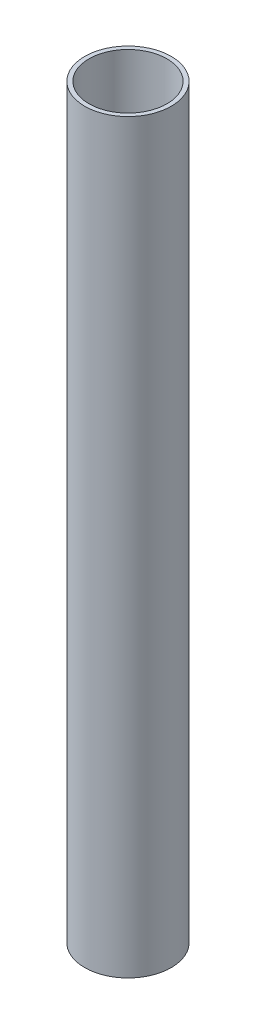
ISO-10303-21;
HEADER;
FILE_DESCRIPTION(('STEP AP214'),'2;1');
FILE_NAME('part.step','',(''),(''),'','','');
FILE_SCHEMA(('AUTOMOTIVE_DESIGN { 1 0 10303 214 1 1 1 1 }'));
ENDSEC;
DATA;
#1=APPLICATION_CONTEXT('core data for automotive mechanical design processes');
#2=APPLICATION_PROTOCOL_DEFINITION('international standard','automotive_design',2000,#1);
#3=PRODUCT_CONTEXT('',#1,'mechanical');
#4=PRODUCT('Part','Part','',(#3));
#5=PRODUCT_RELATED_PRODUCT_CATEGORY('part','',(#4));
#6=PRODUCT_DEFINITION_FORMATION('','',#4);
#7=PRODUCT_DEFINITION_CONTEXT('part definition',#1,'design');
#8=PRODUCT_DEFINITION('design','',#6,#7);
#9=PRODUCT_DEFINITION_SHAPE('','',#8);
#10=(LENGTH_UNIT() NAMED_UNIT(*) SI_UNIT(.MILLI.,.METRE.));
#11=(NAMED_UNIT(*) PLANE_ANGLE_UNIT() SI_UNIT($,.RADIAN.));
#12=(NAMED_UNIT(*) SI_UNIT($,.STERADIAN.) SOLID_ANGLE_UNIT());
#13=UNCERTAINTY_MEASURE_WITH_UNIT(LENGTH_MEASURE(1.E-05),#10,'distance_accuracy_value','');
#14=(GEOMETRIC_REPRESENTATION_CONTEXT(3) GLOBAL_UNCERTAINTY_ASSIGNED_CONTEXT((#13)) GLOBAL_UNIT_ASSIGNED_CONTEXT((#10,
#11,#12)) REPRESENTATION_CONTEXT('',''));
#15=CARTESIAN_POINT('',(0.,0.,0.));
#16=DIRECTION('',(0.,0.,1.));
#17=DIRECTION('',(1.,0.,0.));
#18=AXIS2_PLACEMENT_3D('',#15,#16,#17);
#19=CARTESIAN_POINT('',(0.,110.,0.));
#20=DIRECTION('',(0.,1.,0.));
#21=DIRECTION('',(0.,0.,1.));
#22=AXIS2_PLACEMENT_3D('',#19,#20,#21);
#23=PLANE('',#22);
#24=CARTESIAN_POINT('',(0.,110.,0.));
#25=DIRECTION('',(0.,1.,0.));
#26=DIRECTION('',(0.,0.,1.));
#27=AXIS2_PLACEMENT_3D('',#24,#25,#26);
#28=CIRCLE('',#27,12.75);
#29=CARTESIAN_POINT('',(0.,110.,12.75));
#30=VERTEX_POINT('',#29);
#31=EDGE_CURVE('E10',#30,#30,#28,.T.);
#32=ORIENTED_EDGE('',*,*,#31,.T.);
#33=EDGE_LOOP('',(#32));
#34=FACE_BOUND('',#33,.T.);
#35=CARTESIAN_POINT('',(0.,110.,0.));
#36=DIRECTION('',(0.,1.,0.));
#37=DIRECTION('',(0.,0.,1.));
#38=AXIS2_PLACEMENT_3D('',#35,#36,#37);
#39=CIRCLE('',#38,11.5);
#40=CARTESIAN_POINT('',(0.,110.,11.5));
#41=VERTEX_POINT('',#40);
#42=EDGE_CURVE('E56',#41,#41,#39,.T.);
#43=ORIENTED_EDGE('',*,*,#42,.F.);
#44=EDGE_LOOP('',(#43));
#45=FACE_BOUND('',#44,.T.);
#46=ADVANCED_FACE('F43',(#34,#45),#23,.T.);
#47=CARTESIAN_POINT('',(0.,-110.,0.));
#48=DIRECTION('',(0.,1.,0.));
#49=DIRECTION('',(0.,0.,1.));
#50=AXIS2_PLACEMENT_3D('',#47,#48,#49);
#51=PLANE('',#50);
#52=CARTESIAN_POINT('',(0.,-110.,0.));
#53=DIRECTION('',(0.,1.,0.));
#54=DIRECTION('',(0.,0.,1.));
#55=AXIS2_PLACEMENT_3D('',#52,#53,#54);
#56=CIRCLE('',#55,12.75);
#57=CARTESIAN_POINT('',(0.,-110.,12.75));
#58=VERTEX_POINT('',#57);
#59=EDGE_CURVE('E47',#58,#58,#56,.T.);
#60=ORIENTED_EDGE('',*,*,#59,.F.);
#61=EDGE_LOOP('',(#60));
#62=FACE_BOUND('',#61,.T.);
#63=CARTESIAN_POINT('',(0.,-110.,0.));
#64=DIRECTION('',(0.,1.,0.));
#65=DIRECTION('',(0.,0.,1.));
#66=AXIS2_PLACEMENT_3D('',#63,#64,#65);
#67=CIRCLE('',#66,11.5);
#68=CARTESIAN_POINT('',(0.,-110.,11.5));
#69=VERTEX_POINT('',#68);
#70=EDGE_CURVE('E58',#69,#69,#67,.T.);
#71=ORIENTED_EDGE('',*,*,#70,.T.);
#72=EDGE_LOOP('',(#71));
#73=FACE_BOUND('',#72,.T.);
#74=ADVANCED_FACE('F70',(#62,#73),#51,.F.);
#75=CARTESIAN_POINT('',(0.,110.,0.));
#76=DIRECTION('',(0.,-1.,0.));
#77=DIRECTION('',(0.,0.,-1.));
#78=AXIS2_PLACEMENT_3D('',#75,#76,#77);
#79=CYLINDRICAL_SURFACE('',#78,12.75);
#80=ORIENTED_EDGE('',*,*,#31,.F.);
#81=EDGE_LOOP('',(#80));
#82=FACE_BOUND('',#81,.T.);
#83=ORIENTED_EDGE('',*,*,#59,.T.);
#84=EDGE_LOOP('',(#83));
#85=FACE_BOUND('',#84,.T.);
#86=ADVANCED_FACE('F45',(#82,#85),#79,.T.);
#87=CARTESIAN_POINT('',(0.,110.,0.));
#88=DIRECTION('',(0.,-1.,0.));
#89=DIRECTION('',(0.,0.,-1.));
#90=AXIS2_PLACEMENT_3D('',#87,#88,#89);
#91=CYLINDRICAL_SURFACE('',#90,11.5);
#92=ORIENTED_EDGE('',*,*,#42,.T.);
#93=EDGE_LOOP('',(#92));
#94=FACE_BOUND('',#93,.T.);
#95=ORIENTED_EDGE('',*,*,#70,.F.);
#96=EDGE_LOOP('',(#95));
#97=FACE_BOUND('',#96,.T.);
#98=ADVANCED_FACE('F66',(#94,#97),#91,.F.);
#99=CLOSED_SHELL('',(#46,#74,#86,#98));
#100=MANIFOLD_SOLID_BREP('B2',#99);
#101=ADVANCED_BREP_SHAPE_REPRESENTATION('',(#18,#100),#14);
#102=SHAPE_DEFINITION_REPRESENTATION(#9,#101);
ENDSEC;
END-ISO-10303-21;
